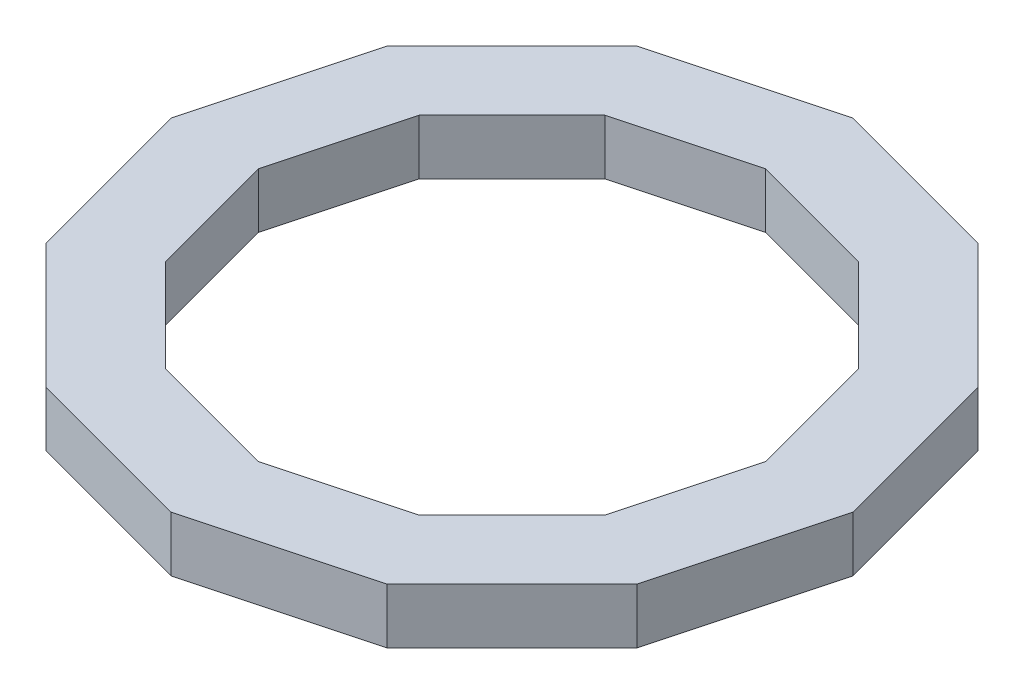
ISO-10303-21;
HEADER;
FILE_DESCRIPTION(('STEP AP214'),'2;1');
FILE_NAME('part.step','',(''),(''),'','','');
FILE_SCHEMA(('AUTOMOTIVE_DESIGN { 1 0 10303 214 1 1 1 1 }'));
ENDSEC;
DATA;
#1=APPLICATION_CONTEXT('core data for automotive mechanical design processes');
#2=APPLICATION_PROTOCOL_DEFINITION('international standard','automotive_design',2000,#1);
#3=PRODUCT_CONTEXT('',#1,'mechanical');
#4=PRODUCT('Part','Part','',(#3));
#5=PRODUCT_RELATED_PRODUCT_CATEGORY('part','',(#4));
#6=PRODUCT_DEFINITION_FORMATION('','',#4);
#7=PRODUCT_DEFINITION_CONTEXT('part definition',#1,'design');
#8=PRODUCT_DEFINITION('design','',#6,#7);
#9=PRODUCT_DEFINITION_SHAPE('','',#8);
#10=(LENGTH_UNIT() NAMED_UNIT(*) SI_UNIT(.MILLI.,.METRE.));
#11=(NAMED_UNIT(*) PLANE_ANGLE_UNIT() SI_UNIT($,.RADIAN.));
#12=(NAMED_UNIT(*) SI_UNIT($,.STERADIAN.) SOLID_ANGLE_UNIT());
#13=UNCERTAINTY_MEASURE_WITH_UNIT(LENGTH_MEASURE(1.E-05),#10,'distance_accuracy_value','');
#14=(GEOMETRIC_REPRESENTATION_CONTEXT(3) GLOBAL_UNCERTAINTY_ASSIGNED_CONTEXT((#13)) GLOBAL_UNIT_ASSIGNED_CONTEXT((#10,
#11,#12)) REPRESENTATION_CONTEXT('',''));
#15=CARTESIAN_POINT('',(0.,0.,0.));
#16=DIRECTION('',(0.,0.,1.));
#17=DIRECTION('',(1.,0.,0.));
#18=AXIS2_PLACEMENT_3D('',#15,#16,#17);
#19=CARTESIAN_POINT('',(0.,19.05,0.));
#20=DIRECTION('',(0.,1.,0.));
#21=DIRECTION('',(0.,0.,1.));
#22=AXIS2_PLACEMENT_3D('',#19,#20,#21);
#23=PLANE('',#22);
#24=DIRECTION('',(0.258819045102521,0.,-0.965925826289068));
#25=VECTOR('',#24,1.);
#26=CARTESIAN_POINT('',(101.988067751713,19.05,58.8828383705816));
#27=LINE('',#26,#25);
#28=CARTESIAN_POINT('',(101.988067751713,19.05,58.8828383705816));
#29=VERTEX_POINT('',#28);
#30=CARTESIAN_POINT('',(117.765676741163,19.05,0.));
#31=VERTEX_POINT('',#30);
#32=EDGE_CURVE('E299',#29,#31,#27,.T.);
#33=ORIENTED_EDGE('',*,*,#32,.T.);
#34=DIRECTION('',(-0.258819045102521,0.,-0.965925826289068));
#35=VECTOR('',#34,1.);
#36=CARTESIAN_POINT('',(117.765676741163,19.05,0.));
#37=LINE('',#36,#35);
#38=CARTESIAN_POINT('',(101.988067751713,19.05,-58.8828383705815));
#39=VERTEX_POINT('',#38);
#40=EDGE_CURVE('E302',#31,#39,#37,.T.);
#41=ORIENTED_EDGE('',*,*,#40,.T.);
#42=DIRECTION('',(-0.707106781186547,0.,-0.707106781186548));
#43=VECTOR('',#42,1.);
#44=CARTESIAN_POINT('',(101.988067751713,19.05,-58.8828383705815));
#45=LINE('',#44,#43);
#46=CARTESIAN_POINT('',(58.8828383705815,19.05,-101.988067751714));
#47=VERTEX_POINT('',#46);
#48=EDGE_CURVE('E306',#39,#47,#45,.T.);
#49=ORIENTED_EDGE('',*,*,#48,.T.);
#50=DIRECTION('',(-0.965925826289068,0.,-0.258819045102521));
#51=VECTOR('',#50,1.);
#52=CARTESIAN_POINT('',(58.8828383705815,19.05,-101.988067751714));
#53=LINE('',#52,#51);
#54=CARTESIAN_POINT('',(0.,19.05,-117.765676741163));
#55=VERTEX_POINT('',#54);
#56=EDGE_CURVE('E308',#47,#55,#53,.T.);
#57=ORIENTED_EDGE('',*,*,#56,.T.);
#58=DIRECTION('',(-0.965925826289069,0.,0.25881904510252));
#59=VECTOR('',#58,1.);
#60=CARTESIAN_POINT('',(0.,19.05,-117.765676741163));
#61=LINE('',#60,#59);
#62=CARTESIAN_POINT('',(-58.8828383705815,19.05,-101.988067751714));
#63=VERTEX_POINT('',#62);
#64=EDGE_CURVE('E310',#55,#63,#61,.T.);
#65=ORIENTED_EDGE('',*,*,#64,.T.);
#66=DIRECTION('',(-0.707106781186547,0.,0.707106781186547));
#67=VECTOR('',#66,1.);
#68=CARTESIAN_POINT('',(-58.8828383705815,19.05,-101.988067751714));
#69=LINE('',#68,#67);
#70=CARTESIAN_POINT('',(-101.988067751713,19.05,-58.8828383705816));
#71=VERTEX_POINT('',#70);
#72=EDGE_CURVE('E312',#63,#71,#69,.T.);
#73=ORIENTED_EDGE('',*,*,#72,.T.);
#74=DIRECTION('',(-0.258819045102521,0.,0.965925826289068));
#75=VECTOR('',#74,1.);
#76=CARTESIAN_POINT('',(-101.988067751713,19.05,-58.8828383705816));
#77=LINE('',#76,#75);
#78=CARTESIAN_POINT('',(-117.765676741163,19.05,0.));
#79=VERTEX_POINT('',#78);
#80=EDGE_CURVE('E314',#71,#79,#77,.T.);
#81=ORIENTED_EDGE('',*,*,#80,.T.);
#82=DIRECTION('',(0.25881904510252,0.,0.965925826289069));
#83=VECTOR('',#82,1.);
#84=CARTESIAN_POINT('',(-117.765676741163,19.05,0.));
#85=LINE('',#84,#83);
#86=CARTESIAN_POINT('',(-101.988067751714,19.05,58.8828383705815));
#87=VERTEX_POINT('',#86);
#88=EDGE_CURVE('E316',#79,#87,#85,.T.);
#89=ORIENTED_EDGE('',*,*,#88,.T.);
#90=DIRECTION('',(0.707106781186547,0.,0.707106781186548));
#91=VECTOR('',#90,1.);
#92=CARTESIAN_POINT('',(-101.988067751714,19.05,58.8828383705815));
#93=LINE('',#92,#91);
#94=CARTESIAN_POINT('',(-58.8828383705816,19.05,101.988067751713));
#95=VERTEX_POINT('',#94);
#96=EDGE_CURVE('E318',#87,#95,#93,.T.);
#97=ORIENTED_EDGE('',*,*,#96,.T.);
#98=DIRECTION('',(0.965925826289068,0.,0.258819045102521));
#99=VECTOR('',#98,1.);
#100=CARTESIAN_POINT('',(-58.8828383705816,19.05,101.988067751713));
#101=LINE('',#100,#99);
#102=CARTESIAN_POINT('',(0.,19.05,117.765676741163));
#103=VERTEX_POINT('',#102);
#104=EDGE_CURVE('E320',#95,#103,#101,.T.);
#105=ORIENTED_EDGE('',*,*,#104,.T.);
#106=DIRECTION('',(0.965925826289068,0.,-0.25881904510252));
#107=VECTOR('',#106,1.);
#108=CARTESIAN_POINT('',(0.,19.05,117.765676741163));
#109=LINE('',#108,#107);
#110=CARTESIAN_POINT('',(58.8828383705815,19.05,101.988067751714));
#111=VERTEX_POINT('',#110);
#112=EDGE_CURVE('E322',#103,#111,#109,.T.);
#113=ORIENTED_EDGE('',*,*,#112,.T.);
#114=DIRECTION('',(0.707106781186548,0.,-0.707106781186547));
#115=VECTOR('',#114,1.);
#116=CARTESIAN_POINT('',(58.8828383705815,19.05,101.988067751714));
#117=LINE('',#116,#115);
#118=EDGE_CURVE('E324',#111,#29,#117,.T.);
#119=ORIENTED_EDGE('',*,*,#118,.T.);
#120=EDGE_LOOP('',(#33,#41,#49,#57,#65,#73,#81,#89,#97,#105,#113,#119));
#121=FACE_BOUND('',#120,.T.);
#122=DIRECTION('',(-0.258819045102521,0.,-0.965925826289068));
#123=VECTOR('',#122,1.);
#124=CARTESIAN_POINT('',(87.5252595113846,19.05,0.));
#125=LINE('',#124,#123);
#126=CARTESIAN_POINT('',(87.5252595113846,19.05,0.));
#127=VERTEX_POINT('',#126);
#128=CARTESIAN_POINT('',(75.7990982096847,19.05,-43.7626297556922));
#129=VERTEX_POINT('',#128);
#130=EDGE_CURVE('E204',#127,#129,#125,.T.);
#131=ORIENTED_EDGE('',*,*,#130,.F.);
#132=DIRECTION('',(0.258819045102521,0.,-0.965925826289068));
#133=VECTOR('',#132,1.);
#134=CARTESIAN_POINT('',(75.7990982096846,19.05,43.7626297556923));
#135=LINE('',#134,#133);
#136=CARTESIAN_POINT('',(75.7990982096846,19.05,43.7626297556923));
#137=VERTEX_POINT('',#136);
#138=EDGE_CURVE('E196',#137,#127,#135,.T.);
#139=ORIENTED_EDGE('',*,*,#138,.F.);
#140=DIRECTION('',(0.707106781186548,0.,-0.707106781186547));
#141=VECTOR('',#140,1.);
#142=CARTESIAN_POINT('',(43.7626297556923,19.05,75.7990982096846));
#143=LINE('',#142,#141);
#144=CARTESIAN_POINT('',(43.7626297556923,19.05,75.7990982096846));
#145=VERTEX_POINT('',#144);
#146=EDGE_CURVE('E243',#145,#137,#143,.T.);
#147=ORIENTED_EDGE('',*,*,#146,.F.);
#148=DIRECTION('',(0.965925826289068,0.,-0.258819045102521));
#149=VECTOR('',#148,1.);
#150=CARTESIAN_POINT('',(0.,19.05,87.5252595113846));
#151=LINE('',#150,#149);
#152=CARTESIAN_POINT('',(0.,19.05,87.5252595113846));
#153=VERTEX_POINT('',#152);
#154=EDGE_CURVE('E241',#153,#145,#151,.T.);
#155=ORIENTED_EDGE('',*,*,#154,.F.);
#156=DIRECTION('',(0.965925826289068,0.,0.258819045102521));
#157=VECTOR('',#156,1.);
#158=CARTESIAN_POINT('',(-43.7626297556923,19.05,75.7990982096846));
#159=LINE('',#158,#157);
#160=CARTESIAN_POINT('',(-43.7626297556923,19.05,75.7990982096846));
#161=VERTEX_POINT('',#160);
#162=EDGE_CURVE('E239',#161,#153,#159,.T.);
#163=ORIENTED_EDGE('',*,*,#162,.F.);
#164=DIRECTION('',(0.707106781186547,0.,0.707106781186547));
#165=VECTOR('',#164,1.);
#166=CARTESIAN_POINT('',(-75.7990982096846,19.05,43.7626297556923));
#167=LINE('',#166,#165);
#168=CARTESIAN_POINT('',(-75.7990982096846,19.05,43.7626297556923));
#169=VERTEX_POINT('',#168);
#170=EDGE_CURVE('E237',#169,#161,#167,.T.);
#171=ORIENTED_EDGE('',*,*,#170,.F.);
#172=DIRECTION('',(0.258819045102521,0.,0.965925826289068));
#173=VECTOR('',#172,1.);
#174=CARTESIAN_POINT('',(-87.5252595113846,19.05,0.));
#175=LINE('',#174,#173);
#176=CARTESIAN_POINT('',(-87.5252595113846,19.05,0.));
#177=VERTEX_POINT('',#176);
#178=EDGE_CURVE('E235',#177,#169,#175,.T.);
#179=ORIENTED_EDGE('',*,*,#178,.F.);
#180=DIRECTION('',(-0.258819045102521,0.,0.965925826289068));
#181=VECTOR('',#180,1.);
#182=CARTESIAN_POINT('',(-75.7990982096846,19.05,-43.7626297556923));
#183=LINE('',#182,#181);
#184=CARTESIAN_POINT('',(-75.7990982096846,19.05,-43.7626297556923));
#185=VERTEX_POINT('',#184);
#186=EDGE_CURVE('E233',#185,#177,#183,.T.);
#187=ORIENTED_EDGE('',*,*,#186,.F.);
#188=DIRECTION('',(-0.707106781186548,0.,0.707106781186548));
#189=VECTOR('',#188,1.);
#190=CARTESIAN_POINT('',(-43.7626297556923,19.05,-75.7990982096846));
#191=LINE('',#190,#189);
#192=CARTESIAN_POINT('',(-43.7626297556923,19.05,-75.7990982096846));
#193=VERTEX_POINT('',#192);
#194=EDGE_CURVE('E231',#193,#185,#191,.T.);
#195=ORIENTED_EDGE('',*,*,#194,.F.);
#196=DIRECTION('',(-0.965925826289068,0.,0.258819045102521));
#197=VECTOR('',#196,1.);
#198=CARTESIAN_POINT('',(0.,19.05,-87.5252595113846));
#199=LINE('',#198,#197);
#200=CARTESIAN_POINT('',(0.,19.05,-87.5252595113846));
#201=VERTEX_POINT('',#200);
#202=EDGE_CURVE('E228',#201,#193,#199,.T.);
#203=ORIENTED_EDGE('',*,*,#202,.F.);
#204=DIRECTION('',(-0.965925826289068,0.,-0.258819045102521));
#205=VECTOR('',#204,1.);
#206=CARTESIAN_POINT('',(43.7626297556922,19.05,-75.7990982096847));
#207=LINE('',#206,#205);
#208=CARTESIAN_POINT('',(43.7626297556922,19.05,-75.7990982096847));
#209=VERTEX_POINT('',#208);
#210=EDGE_CURVE('E223',#209,#201,#207,.T.);
#211=ORIENTED_EDGE('',*,*,#210,.F.);
#212=DIRECTION('',(-0.707106781186548,0.,-0.707106781186547));
#213=VECTOR('',#212,1.);
#214=CARTESIAN_POINT('',(75.7990982096847,19.05,-43.7626297556922));
#215=LINE('',#214,#213);
#216=EDGE_CURVE('E217',#129,#209,#215,.T.);
#217=ORIENTED_EDGE('',*,*,#216,.F.);
#218=EDGE_LOOP('',(#131,#139,#147,#155,#163,#171,#179,#187,#195,#203,#211,#217));
#219=FACE_BOUND('',#218,.T.);
#220=ADVANCED_FACE('F35',(#121,#219),#23,.T.);
#221=CARTESIAN_POINT('',(0.,0.,0.));
#222=DIRECTION('',(0.,1.,0.));
#223=DIRECTION('',(0.,0.,1.));
#224=AXIS2_PLACEMENT_3D('',#221,#222,#223);
#225=PLANE('',#224);
#226=DIRECTION('',(0.258819045102521,0.,-0.965925826289068));
#227=VECTOR('',#226,1.);
#228=CARTESIAN_POINT('',(101.988067751713,0.,58.8828383705816));
#229=LINE('',#228,#227);
#230=CARTESIAN_POINT('',(101.988067751713,0.,58.8828383705816));
#231=VERTEX_POINT('',#230);
#232=CARTESIAN_POINT('',(117.765676741163,0.,0.));
#233=VERTEX_POINT('',#232);
#234=EDGE_CURVE('E212',#231,#233,#229,.T.);
#235=ORIENTED_EDGE('',*,*,#234,.F.);
#236=DIRECTION('',(0.707106781186548,0.,-0.707106781186547));
#237=VECTOR('',#236,1.);
#238=CARTESIAN_POINT('',(58.8828383705815,0.,101.988067751714));
#239=LINE('',#238,#237);
#240=CARTESIAN_POINT('',(58.8828383705815,0.,101.988067751714));
#241=VERTEX_POINT('',#240);
#242=EDGE_CURVE('E303',#241,#231,#239,.T.);
#243=ORIENTED_EDGE('',*,*,#242,.F.);
#244=DIRECTION('',(0.965925826289068,0.,-0.25881904510252));
#245=VECTOR('',#244,1.);
#246=CARTESIAN_POINT('',(0.,0.,117.765676741163));
#247=LINE('',#246,#245);
#248=CARTESIAN_POINT('',(0.,0.,117.765676741163));
#249=VERTEX_POINT('',#248);
#250=EDGE_CURVE('E348',#249,#241,#247,.T.);
#251=ORIENTED_EDGE('',*,*,#250,.F.);
#252=DIRECTION('',(0.965925826289068,0.,0.258819045102521));
#253=VECTOR('',#252,1.);
#254=CARTESIAN_POINT('',(-58.8828383705816,0.,101.988067751713));
#255=LINE('',#254,#253);
#256=CARTESIAN_POINT('',(-58.8828383705816,0.,101.988067751713));
#257=VERTEX_POINT('',#256);
#258=EDGE_CURVE('E346',#257,#249,#255,.T.);
#259=ORIENTED_EDGE('',*,*,#258,.F.);
#260=DIRECTION('',(0.707106781186547,0.,0.707106781186548));
#261=VECTOR('',#260,1.);
#262=CARTESIAN_POINT('',(-101.988067751714,0.,58.8828383705815));
#263=LINE('',#262,#261);
#264=CARTESIAN_POINT('',(-101.988067751714,0.,58.8828383705815));
#265=VERTEX_POINT('',#264);
#266=EDGE_CURVE('E344',#265,#257,#263,.T.);
#267=ORIENTED_EDGE('',*,*,#266,.F.);
#268=DIRECTION('',(0.25881904510252,0.,0.965925826289069));
#269=VECTOR('',#268,1.);
#270=CARTESIAN_POINT('',(-117.765676741163,0.,0.));
#271=LINE('',#270,#269);
#272=CARTESIAN_POINT('',(-117.765676741163,0.,0.));
#273=VERTEX_POINT('',#272);
#274=EDGE_CURVE('E342',#273,#265,#271,.T.);
#275=ORIENTED_EDGE('',*,*,#274,.F.);
#276=DIRECTION('',(-0.258819045102521,0.,0.965925826289068));
#277=VECTOR('',#276,1.);
#278=CARTESIAN_POINT('',(-101.988067751713,0.,-58.8828383705816));
#279=LINE('',#278,#277);
#280=CARTESIAN_POINT('',(-101.988067751713,0.,-58.8828383705816));
#281=VERTEX_POINT('',#280);
#282=EDGE_CURVE('E340',#281,#273,#279,.T.);
#283=ORIENTED_EDGE('',*,*,#282,.F.);
#284=DIRECTION('',(-0.707106781186547,0.,0.707106781186547));
#285=VECTOR('',#284,1.);
#286=CARTESIAN_POINT('',(-58.8828383705815,0.,-101.988067751714));
#287=LINE('',#286,#285);
#288=CARTESIAN_POINT('',(-58.8828383705815,0.,-101.988067751714));
#289=VERTEX_POINT('',#288);
#290=EDGE_CURVE('E338',#289,#281,#287,.T.);
#291=ORIENTED_EDGE('',*,*,#290,.F.);
#292=DIRECTION('',(-0.965925826289069,0.,0.25881904510252));
#293=VECTOR('',#292,1.);
#294=CARTESIAN_POINT('',(0.,0.,-117.765676741163));
#295=LINE('',#294,#293);
#296=CARTESIAN_POINT('',(0.,0.,-117.765676741163));
#297=VERTEX_POINT('',#296);
#298=EDGE_CURVE('E336',#297,#289,#295,.T.);
#299=ORIENTED_EDGE('',*,*,#298,.F.);
#300=DIRECTION('',(-0.965925826289068,0.,-0.258819045102521));
#301=VECTOR('',#300,1.);
#302=CARTESIAN_POINT('',(58.8828383705815,0.,-101.988067751714));
#303=LINE('',#302,#301);
#304=CARTESIAN_POINT('',(58.8828383705815,0.,-101.988067751714));
#305=VERTEX_POINT('',#304);
#306=EDGE_CURVE('E334',#305,#297,#303,.T.);
#307=ORIENTED_EDGE('',*,*,#306,.F.);
#308=DIRECTION('',(-0.707106781186547,0.,-0.707106781186548));
#309=VECTOR('',#308,1.);
#310=CARTESIAN_POINT('',(101.988067751713,0.,-58.8828383705815));
#311=LINE('',#310,#309);
#312=CARTESIAN_POINT('',(101.988067751713,0.,-58.8828383705815));
#313=VERTEX_POINT('',#312);
#314=EDGE_CURVE('E332',#313,#305,#311,.T.);
#315=ORIENTED_EDGE('',*,*,#314,.F.);
#316=DIRECTION('',(-0.258819045102521,0.,-0.965925826289068));
#317=VECTOR('',#316,1.);
#318=CARTESIAN_POINT('',(117.765676741163,0.,0.));
#319=LINE('',#318,#317);
#320=EDGE_CURVE('E329',#233,#313,#319,.T.);
#321=ORIENTED_EDGE('',*,*,#320,.F.);
#322=EDGE_LOOP('',(#235,#243,#251,#259,#267,#275,#283,#291,#299,#307,#315,#321));
#323=FACE_BOUND('',#322,.T.);
#324=DIRECTION('',(0.258819045102521,0.,-0.965925826289068));
#325=VECTOR('',#324,1.);
#326=CARTESIAN_POINT('',(75.7990982096846,0.,43.7626297556923));
#327=LINE('',#326,#325);
#328=CARTESIAN_POINT('',(75.7990982096846,0.,43.7626297556923));
#329=VERTEX_POINT('',#328);
#330=CARTESIAN_POINT('',(87.5252595113846,0.,0.));
#331=VERTEX_POINT('',#330);
#332=EDGE_CURVE('E58',#329,#331,#327,.T.);
#333=ORIENTED_EDGE('',*,*,#332,.T.);
#334=DIRECTION('',(-0.258819045102521,0.,-0.965925826289068));
#335=VECTOR('',#334,1.);
#336=CARTESIAN_POINT('',(87.5252595113846,0.,0.));
#337=LINE('',#336,#335);
#338=CARTESIAN_POINT('',(75.7990982096847,0.,-43.7626297556922));
#339=VERTEX_POINT('',#338);
#340=EDGE_CURVE('E211',#331,#339,#337,.T.);
#341=ORIENTED_EDGE('',*,*,#340,.T.);
#342=DIRECTION('',(-0.707106781186548,0.,-0.707106781186547));
#343=VECTOR('',#342,1.);
#344=CARTESIAN_POINT('',(75.7990982096847,0.,-43.7626297556922));
#345=LINE('',#344,#343);
#346=CARTESIAN_POINT('',(43.7626297556922,0.,-75.7990982096847));
#347=VERTEX_POINT('',#346);
#348=EDGE_CURVE('E248',#339,#347,#345,.T.);
#349=ORIENTED_EDGE('',*,*,#348,.T.);
#350=DIRECTION('',(-0.965925826289068,0.,-0.258819045102521));
#351=VECTOR('',#350,1.);
#352=CARTESIAN_POINT('',(43.7626297556922,0.,-75.7990982096847));
#353=LINE('',#352,#351);
#354=CARTESIAN_POINT('',(0.,0.,-87.5252595113846));
#355=VERTEX_POINT('',#354);
#356=EDGE_CURVE('E251',#347,#355,#353,.T.);
#357=ORIENTED_EDGE('',*,*,#356,.T.);
#358=DIRECTION('',(-0.965925826289068,0.,0.258819045102521));
#359=VECTOR('',#358,1.);
#360=CARTESIAN_POINT('',(0.,0.,-87.5252595113846));
#361=LINE('',#360,#359);
#362=CARTESIAN_POINT('',(-43.7626297556923,0.,-75.7990982096846));
#363=VERTEX_POINT('',#362);
#364=EDGE_CURVE('E255',#355,#363,#361,.T.);
#365=ORIENTED_EDGE('',*,*,#364,.T.);
#366=DIRECTION('',(-0.707106781186548,0.,0.707106781186548));
#367=VECTOR('',#366,1.);
#368=CARTESIAN_POINT('',(-43.7626297556923,0.,-75.7990982096846));
#369=LINE('',#368,#367);
#370=CARTESIAN_POINT('',(-75.7990982096846,0.,-43.7626297556923));
#371=VERTEX_POINT('',#370);
#372=EDGE_CURVE('E258',#363,#371,#369,.T.);
#373=ORIENTED_EDGE('',*,*,#372,.T.);
#374=DIRECTION('',(-0.258819045102521,0.,0.965925826289068));
#375=VECTOR('',#374,1.);
#376=CARTESIAN_POINT('',(-75.7990982096846,0.,-43.7626297556923));
#377=LINE('',#376,#375);
#378=CARTESIAN_POINT('',(-87.5252595113846,0.,0.));
#379=VERTEX_POINT('',#378);
#380=EDGE_CURVE('E261',#371,#379,#377,.T.);
#381=ORIENTED_EDGE('',*,*,#380,.T.);
#382=DIRECTION('',(0.258819045102521,0.,0.965925826289068));
#383=VECTOR('',#382,1.);
#384=CARTESIAN_POINT('',(-87.5252595113846,0.,0.));
#385=LINE('',#384,#383);
#386=CARTESIAN_POINT('',(-75.7990982096846,0.,43.7626297556923));
#387=VERTEX_POINT('',#386);
#388=EDGE_CURVE('E265',#379,#387,#385,.T.);
#389=ORIENTED_EDGE('',*,*,#388,.T.);
#390=DIRECTION('',(0.707106781186547,0.,0.707106781186547));
#391=VECTOR('',#390,1.);
#392=CARTESIAN_POINT('',(-75.7990982096846,0.,43.7626297556923));
#393=LINE('',#392,#391);
#394=CARTESIAN_POINT('',(-43.7626297556923,0.,75.7990982096846));
#395=VERTEX_POINT('',#394);
#396=EDGE_CURVE('E268',#387,#395,#393,.T.);
#397=ORIENTED_EDGE('',*,*,#396,.T.);
#398=DIRECTION('',(0.965925826289068,0.,0.258819045102521));
#399=VECTOR('',#398,1.);
#400=CARTESIAN_POINT('',(-43.7626297556923,0.,75.7990982096846));
#401=LINE('',#400,#399);
#402=CARTESIAN_POINT('',(0.,0.,87.5252595113846));
#403=VERTEX_POINT('',#402);
#404=EDGE_CURVE('E271',#395,#403,#401,.T.);
#405=ORIENTED_EDGE('',*,*,#404,.T.);
#406=DIRECTION('',(0.965925826289068,0.,-0.258819045102521));
#407=VECTOR('',#406,1.);
#408=CARTESIAN_POINT('',(0.,0.,87.5252595113846));
#409=LINE('',#408,#407);
#410=CARTESIAN_POINT('',(43.7626297556923,0.,75.7990982096846));
#411=VERTEX_POINT('',#410);
#412=EDGE_CURVE('E274',#403,#411,#409,.T.);
#413=ORIENTED_EDGE('',*,*,#412,.T.);
#414=DIRECTION('',(0.707106781186548,0.,-0.707106781186547));
#415=VECTOR('',#414,1.);
#416=CARTESIAN_POINT('',(43.7626297556923,0.,75.7990982096846));
#417=LINE('',#416,#415);
#418=EDGE_CURVE('E205',#411,#329,#417,.T.);
#419=ORIENTED_EDGE('',*,*,#418,.T.);
#420=EDGE_LOOP('',(#333,#341,#349,#357,#365,#373,#381,#389,#397,#405,#413,#419));
#421=FACE_BOUND('',#420,.T.);
#422=ADVANCED_FACE('F391',(#323,#421),#225,.F.);
#423=CARTESIAN_POINT('',(101.988067751713,19.05,58.8828383705816));
#424=DIRECTION('',(-0.965925826289068,0.,-0.258819045102521));
#425=DIRECTION('',(-0.258819045102521,0.,0.965925826289068));
#426=AXIS2_PLACEMENT_3D('',#423,#424,#425);
#427=PLANE('',#426);
#428=ORIENTED_EDGE('',*,*,#234,.T.);
#429=DIRECTION('',(0.,-1.,0.));
#430=VECTOR('',#429,1.);
#431=CARTESIAN_POINT('',(117.765676741163,19.05,0.));
#432=LINE('',#431,#430);
#433=EDGE_CURVE('E11',#31,#233,#432,.T.);
#434=ORIENTED_EDGE('',*,*,#433,.F.);
#435=ORIENTED_EDGE('',*,*,#32,.F.);
#436=DIRECTION('',(0.,-1.,0.));
#437=VECTOR('',#436,1.);
#438=CARTESIAN_POINT('',(101.988067751713,19.05,58.8828383705816));
#439=LINE('',#438,#437);
#440=EDGE_CURVE('E326',#29,#231,#439,.T.);
#441=ORIENTED_EDGE('',*,*,#440,.T.);
#442=EDGE_LOOP('',(#428,#434,#435,#441));
#443=FACE_BOUND('',#442,.T.);
#444=ADVANCED_FACE('F37',(#443),#427,.F.);
#445=CARTESIAN_POINT('',(117.765676741163,19.05,0.));
#446=DIRECTION('',(-0.965925826289068,0.,0.258819045102521));
#447=DIRECTION('',(0.258819045102521,0.,0.965925826289068));
#448=AXIS2_PLACEMENT_3D('',#445,#446,#447);
#449=PLANE('',#448);
#450=ORIENTED_EDGE('',*,*,#320,.T.);
#451=DIRECTION('',(0.,-1.,0.));
#452=VECTOR('',#451,1.);
#453=CARTESIAN_POINT('',(101.988067751713,19.05,-58.8828383705815));
#454=LINE('',#453,#452);
#455=EDGE_CURVE('E43',#39,#313,#454,.T.);
#456=ORIENTED_EDGE('',*,*,#455,.F.);
#457=ORIENTED_EDGE('',*,*,#40,.F.);
#458=ORIENTED_EDGE('',*,*,#433,.T.);
#459=EDGE_LOOP('',(#450,#456,#457,#458));
#460=FACE_BOUND('',#459,.T.);
#461=ADVANCED_FACE('F408',(#460),#449,.F.);
#462=CARTESIAN_POINT('',(101.988067751713,19.05,-58.8828383705815));
#463=DIRECTION('',(-0.707106781186548,0.,0.707106781186547));
#464=DIRECTION('',(0.707106781186547,0.,0.707106781186548));
#465=AXIS2_PLACEMENT_3D('',#462,#463,#464);
#466=PLANE('',#465);
#467=ORIENTED_EDGE('',*,*,#314,.T.);
#468=DIRECTION('',(0.,-1.,0.));
#469=VECTOR('',#468,1.);
#470=CARTESIAN_POINT('',(58.8828383705815,19.05,-101.988067751714));
#471=LINE('',#470,#469);
#472=EDGE_CURVE('E378',#47,#305,#471,.T.);
#473=ORIENTED_EDGE('',*,*,#472,.F.);
#474=ORIENTED_EDGE('',*,*,#48,.F.);
#475=ORIENTED_EDGE('',*,*,#455,.T.);
#476=EDGE_LOOP('',(#467,#473,#474,#475));
#477=FACE_BOUND('',#476,.T.);
#478=ADVANCED_FACE('F385',(#477),#466,.F.);
#479=CARTESIAN_POINT('',(58.8828383705815,19.05,-101.988067751714));
#480=DIRECTION('',(-0.258819045102521,0.,0.965925826289068));
#481=DIRECTION('',(0.965925826289068,0.,0.258819045102521));
#482=AXIS2_PLACEMENT_3D('',#479,#480,#481);
#483=PLANE('',#482);
#484=ORIENTED_EDGE('',*,*,#306,.T.);
#485=DIRECTION('',(0.,-1.,0.));
#486=VECTOR('',#485,1.);
#487=CARTESIAN_POINT('',(0.,19.05,-117.765676741163));
#488=LINE('',#487,#486);
#489=EDGE_CURVE('E375',#55,#297,#488,.T.);
#490=ORIENTED_EDGE('',*,*,#489,.F.);
#491=ORIENTED_EDGE('',*,*,#56,.F.);
#492=ORIENTED_EDGE('',*,*,#472,.T.);
#493=EDGE_LOOP('',(#484,#490,#491,#492));
#494=FACE_BOUND('',#493,.T.);
#495=ADVANCED_FACE('F397',(#494),#483,.F.);
#496=CARTESIAN_POINT('',(0.,19.05,-117.765676741163));
#497=DIRECTION('',(0.25881904510252,0.,0.965925826289068));
#498=DIRECTION('',(0.965925826289069,0.,-0.25881904510252));
#499=AXIS2_PLACEMENT_3D('',#496,#497,#498);
#500=PLANE('',#499);
#501=ORIENTED_EDGE('',*,*,#298,.T.);
#502=DIRECTION('',(0.,-1.,0.));
#503=VECTOR('',#502,1.);
#504=CARTESIAN_POINT('',(-58.8828383705815,19.05,-101.988067751714));
#505=LINE('',#504,#503);
#506=EDGE_CURVE('E372',#63,#289,#505,.T.);
#507=ORIENTED_EDGE('',*,*,#506,.F.);
#508=ORIENTED_EDGE('',*,*,#64,.F.);
#509=ORIENTED_EDGE('',*,*,#489,.T.);
#510=EDGE_LOOP('',(#501,#507,#508,#509));
#511=FACE_BOUND('',#510,.T.);
#512=ADVANCED_FACE('F401',(#511),#500,.F.);
#513=CARTESIAN_POINT('',(-58.8828383705815,19.05,-101.988067751714));
#514=DIRECTION('',(0.707106781186547,0.,0.707106781186547));
#515=DIRECTION('',(0.707106781186548,0.,-0.707106781186548));
#516=AXIS2_PLACEMENT_3D('',#513,#514,#515);
#517=PLANE('',#516);
#518=ORIENTED_EDGE('',*,*,#290,.T.);
#519=DIRECTION('',(0.,-1.,0.));
#520=VECTOR('',#519,1.);
#521=CARTESIAN_POINT('',(-101.988067751713,19.05,-58.8828383705816));
#522=LINE('',#521,#520);
#523=EDGE_CURVE('E368',#71,#281,#522,.T.);
#524=ORIENTED_EDGE('',*,*,#523,.F.);
#525=ORIENTED_EDGE('',*,*,#72,.F.);
#526=ORIENTED_EDGE('',*,*,#506,.T.);
#527=EDGE_LOOP('',(#518,#524,#525,#526));
#528=FACE_BOUND('',#527,.T.);
#529=ADVANCED_FACE('F441',(#528),#517,.F.);
#530=CARTESIAN_POINT('',(-101.988067751713,19.05,-58.8828383705816));
#531=DIRECTION('',(0.965925826289068,0.,0.258819045102521));
#532=DIRECTION('',(0.258819045102521,0.,-0.965925826289068));
#533=AXIS2_PLACEMENT_3D('',#530,#531,#532);
#534=PLANE('',#533);
#535=ORIENTED_EDGE('',*,*,#282,.T.);
#536=DIRECTION('',(0.,-1.,0.));
#537=VECTOR('',#536,1.);
#538=CARTESIAN_POINT('',(-117.765676741163,19.05,0.));
#539=LINE('',#538,#537);
#540=EDGE_CURVE('E365',#79,#273,#539,.T.);
#541=ORIENTED_EDGE('',*,*,#540,.F.);
#542=ORIENTED_EDGE('',*,*,#80,.F.);
#543=ORIENTED_EDGE('',*,*,#523,.T.);
#544=EDGE_LOOP('',(#535,#541,#542,#543));
#545=FACE_BOUND('',#544,.T.);
#546=ADVANCED_FACE('F439',(#545),#534,.F.);
#547=CARTESIAN_POINT('',(-117.765676741163,19.05,0.));
#548=DIRECTION('',(0.965925826289068,0.,-0.25881904510252));
#549=DIRECTION('',(-0.25881904510252,0.,-0.965925826289068));
#550=AXIS2_PLACEMENT_3D('',#547,#548,#549);
#551=PLANE('',#550);
#552=ORIENTED_EDGE('',*,*,#274,.T.);
#553=DIRECTION('',(0.,-1.,0.));
#554=VECTOR('',#553,1.);
#555=CARTESIAN_POINT('',(-101.988067751714,19.05,58.8828383705815));
#556=LINE('',#555,#554);
#557=EDGE_CURVE('E362',#87,#265,#556,.T.);
#558=ORIENTED_EDGE('',*,*,#557,.F.);
#559=ORIENTED_EDGE('',*,*,#88,.F.);
#560=ORIENTED_EDGE('',*,*,#540,.T.);
#561=EDGE_LOOP('',(#552,#558,#559,#560));
#562=FACE_BOUND('',#561,.T.);
#563=ADVANCED_FACE('F435',(#562),#551,.F.);
#564=CARTESIAN_POINT('',(-101.988067751714,19.05,58.8828383705815));
#565=DIRECTION('',(0.707106781186548,0.,-0.707106781186547));
#566=DIRECTION('',(-0.707106781186547,0.,-0.707106781186548));
#567=AXIS2_PLACEMENT_3D('',#564,#565,#566);
#568=PLANE('',#567);
#569=ORIENTED_EDGE('',*,*,#266,.T.);
#570=DIRECTION('',(0.,-1.,0.));
#571=VECTOR('',#570,1.);
#572=CARTESIAN_POINT('',(-58.8828383705816,19.05,101.988067751713));
#573=LINE('',#572,#571);
#574=EDGE_CURVE('E359',#95,#257,#573,.T.);
#575=ORIENTED_EDGE('',*,*,#574,.F.);
#576=ORIENTED_EDGE('',*,*,#96,.F.);
#577=ORIENTED_EDGE('',*,*,#557,.T.);
#578=EDGE_LOOP('',(#569,#575,#576,#577));
#579=FACE_BOUND('',#578,.T.);
#580=ADVANCED_FACE('F430',(#579),#568,.F.);
#581=CARTESIAN_POINT('',(-58.8828383705816,19.05,101.988067751713));
#582=DIRECTION('',(0.258819045102521,0.,-0.965925826289068));
#583=DIRECTION('',(-0.965925826289068,0.,-0.258819045102521));
#584=AXIS2_PLACEMENT_3D('',#581,#582,#583);
#585=PLANE('',#584);
#586=ORIENTED_EDGE('',*,*,#258,.T.);
#587=DIRECTION('',(0.,-1.,0.));
#588=VECTOR('',#587,1.);
#589=CARTESIAN_POINT('',(0.,19.05,117.765676741163));
#590=LINE('',#589,#588);
#591=EDGE_CURVE('E356',#103,#249,#590,.T.);
#592=ORIENTED_EDGE('',*,*,#591,.F.);
#593=ORIENTED_EDGE('',*,*,#104,.F.);
#594=ORIENTED_EDGE('',*,*,#574,.T.);
#595=EDGE_LOOP('',(#586,#592,#593,#594));
#596=FACE_BOUND('',#595,.T.);
#597=ADVANCED_FACE('F424',(#596),#585,.F.);
#598=CARTESIAN_POINT('',(0.,19.05,117.765676741163));
#599=DIRECTION('',(-0.25881904510252,0.,-0.965925826289068));
#600=DIRECTION('',(-0.965925826289069,0.,0.25881904510252));
#601=AXIS2_PLACEMENT_3D('',#598,#599,#600);
#602=PLANE('',#601);
#603=ORIENTED_EDGE('',*,*,#250,.T.);
#604=DIRECTION('',(0.,-1.,0.));
#605=VECTOR('',#604,1.);
#606=CARTESIAN_POINT('',(58.8828383705815,19.05,101.988067751714));
#607=LINE('',#606,#605);
#608=EDGE_CURVE('E353',#111,#241,#607,.T.);
#609=ORIENTED_EDGE('',*,*,#608,.F.);
#610=ORIENTED_EDGE('',*,*,#112,.F.);
#611=ORIENTED_EDGE('',*,*,#591,.T.);
#612=EDGE_LOOP('',(#603,#609,#610,#611));
#613=FACE_BOUND('',#612,.T.);
#614=ADVANCED_FACE('F420',(#613),#602,.F.);
#615=CARTESIAN_POINT('',(58.8828383705815,19.05,101.988067751714));
#616=DIRECTION('',(-0.707106781186547,0.,-0.707106781186548));
#617=DIRECTION('',(-0.707106781186548,0.,0.707106781186547));
#618=AXIS2_PLACEMENT_3D('',#615,#616,#617);
#619=PLANE('',#618);
#620=ORIENTED_EDGE('',*,*,#242,.T.);
#621=ORIENTED_EDGE('',*,*,#440,.F.);
#622=ORIENTED_EDGE('',*,*,#118,.F.);
#623=ORIENTED_EDGE('',*,*,#608,.T.);
#624=EDGE_LOOP('',(#620,#621,#622,#623));
#625=FACE_BOUND('',#624,.T.);
#626=ADVANCED_FACE('F415',(#625),#619,.F.);
#627=CARTESIAN_POINT('',(75.7990982096846,19.05,43.7626297556923));
#628=DIRECTION('',(-0.965925826289068,0.,-0.258819045102521));
#629=DIRECTION('',(-0.258819045102521,0.,0.965925826289068));
#630=AXIS2_PLACEMENT_3D('',#627,#628,#629);
#631=PLANE('',#630);
#632=ORIENTED_EDGE('',*,*,#332,.F.);
#633=DIRECTION('',(0.,-1.,0.));
#634=VECTOR('',#633,1.);
#635=CARTESIAN_POINT('',(75.7990982096846,19.05,43.7626297556923));
#636=LINE('',#635,#634);
#637=EDGE_CURVE('E200',#137,#329,#636,.T.);
#638=ORIENTED_EDGE('',*,*,#637,.F.);
#639=ORIENTED_EDGE('',*,*,#138,.T.);
#640=DIRECTION('',(0.,-1.,0.));
#641=VECTOR('',#640,1.);
#642=CARTESIAN_POINT('',(87.5252595113846,19.05,0.));
#643=LINE('',#642,#641);
#644=EDGE_CURVE('E199',#127,#331,#643,.T.);
#645=ORIENTED_EDGE('',*,*,#644,.T.);
#646=EDGE_LOOP('',(#632,#638,#639,#645));
#647=FACE_BOUND('',#646,.T.);
#648=ADVANCED_FACE('F198',(#647),#631,.T.);
#649=CARTESIAN_POINT('',(87.5252595113846,19.05,0.));
#650=DIRECTION('',(-0.965925826289068,0.,0.258819045102521));
#651=DIRECTION('',(0.258819045102521,0.,0.965925826289068));
#652=AXIS2_PLACEMENT_3D('',#649,#650,#651);
#653=PLANE('',#652);
#654=ORIENTED_EDGE('',*,*,#340,.F.);
#655=ORIENTED_EDGE('',*,*,#644,.F.);
#656=ORIENTED_EDGE('',*,*,#130,.T.);
#657=DIRECTION('',(0.,-1.,0.));
#658=VECTOR('',#657,1.);
#659=CARTESIAN_POINT('',(75.7990982096847,19.05,-43.7626297556922));
#660=LINE('',#659,#658);
#661=EDGE_CURVE('E213',#129,#339,#660,.T.);
#662=ORIENTED_EDGE('',*,*,#661,.T.);
#663=EDGE_LOOP('',(#654,#655,#656,#662));
#664=FACE_BOUND('',#663,.T.);
#665=ADVANCED_FACE('F208',(#664),#653,.T.);
#666=CARTESIAN_POINT('',(75.7990982096847,19.05,-43.7626297556922));
#667=DIRECTION('',(-0.707106781186547,0.,0.707106781186548));
#668=DIRECTION('',(0.707106781186548,0.,0.707106781186547));
#669=AXIS2_PLACEMENT_3D('',#666,#667,#668);
#670=PLANE('',#669);
#671=ORIENTED_EDGE('',*,*,#348,.F.);
#672=ORIENTED_EDGE('',*,*,#661,.F.);
#673=ORIENTED_EDGE('',*,*,#216,.T.);
#674=DIRECTION('',(0.,-1.,0.));
#675=VECTOR('',#674,1.);
#676=CARTESIAN_POINT('',(43.7626297556922,19.05,-75.7990982096847));
#677=LINE('',#676,#675);
#678=EDGE_CURVE('E296',#209,#347,#677,.T.);
#679=ORIENTED_EDGE('',*,*,#678,.T.);
#680=EDGE_LOOP('',(#671,#672,#673,#679));
#681=FACE_BOUND('',#680,.T.);
#682=ADVANCED_FACE('F499',(#681),#670,.T.);
#683=CARTESIAN_POINT('',(43.7626297556922,19.05,-75.7990982096847));
#684=DIRECTION('',(-0.258819045102521,0.,0.965925826289068));
#685=DIRECTION('',(0.965925826289068,0.,0.258819045102521));
#686=AXIS2_PLACEMENT_3D('',#683,#684,#685);
#687=PLANE('',#686);
#688=ORIENTED_EDGE('',*,*,#356,.F.);
#689=ORIENTED_EDGE('',*,*,#678,.F.);
#690=ORIENTED_EDGE('',*,*,#210,.T.);
#691=DIRECTION('',(0.,-1.,0.));
#692=VECTOR('',#691,1.);
#693=CARTESIAN_POINT('',(0.,19.05,-87.5252595113846));
#694=LINE('',#693,#692);
#695=EDGE_CURVE('E294',#201,#355,#694,.T.);
#696=ORIENTED_EDGE('',*,*,#695,.T.);
#697=EDGE_LOOP('',(#688,#689,#690,#696));
#698=FACE_BOUND('',#697,.T.);
#699=ADVANCED_FACE('F505',(#698),#687,.T.);
#700=CARTESIAN_POINT('',(0.,19.05,-87.5252595113846));
#701=DIRECTION('',(0.258819045102521,0.,0.965925826289068));
#702=DIRECTION('',(0.965925826289068,0.,-0.258819045102521));
#703=AXIS2_PLACEMENT_3D('',#700,#701,#702);
#704=PLANE('',#703);
#705=ORIENTED_EDGE('',*,*,#364,.F.);
#706=ORIENTED_EDGE('',*,*,#695,.F.);
#707=ORIENTED_EDGE('',*,*,#202,.T.);
#708=DIRECTION('',(0.,-1.,0.));
#709=VECTOR('',#708,1.);
#710=CARTESIAN_POINT('',(-43.7626297556923,19.05,-75.7990982096846));
#711=LINE('',#710,#709);
#712=EDGE_CURVE('E292',#193,#363,#711,.T.);
#713=ORIENTED_EDGE('',*,*,#712,.T.);
#714=EDGE_LOOP('',(#705,#706,#707,#713));
#715=FACE_BOUND('',#714,.T.);
#716=ADVANCED_FACE('F513',(#715),#704,.T.);
#717=CARTESIAN_POINT('',(-43.7626297556923,19.05,-75.7990982096846));
#718=DIRECTION('',(0.707106781186548,0.,0.707106781186548));
#719=DIRECTION('',(0.707106781186548,0.,-0.707106781186548));
#720=AXIS2_PLACEMENT_3D('',#717,#718,#719);
#721=PLANE('',#720);
#722=ORIENTED_EDGE('',*,*,#372,.F.);
#723=ORIENTED_EDGE('',*,*,#712,.F.);
#724=ORIENTED_EDGE('',*,*,#194,.T.);
#725=DIRECTION('',(0.,-1.,0.));
#726=VECTOR('',#725,1.);
#727=CARTESIAN_POINT('',(-75.7990982096846,19.05,-43.7626297556923));
#728=LINE('',#727,#726);
#729=EDGE_CURVE('E290',#185,#371,#728,.T.);
#730=ORIENTED_EDGE('',*,*,#729,.T.);
#731=EDGE_LOOP('',(#722,#723,#724,#730));
#732=FACE_BOUND('',#731,.T.);
#733=ADVANCED_FACE('F521',(#732),#721,.T.);
#734=CARTESIAN_POINT('',(-75.7990982096846,19.05,-43.7626297556923));
#735=DIRECTION('',(0.965925826289068,0.,0.258819045102521));
#736=DIRECTION('',(0.258819045102521,0.,-0.965925826289068));
#737=AXIS2_PLACEMENT_3D('',#734,#735,#736);
#738=PLANE('',#737);
#739=ORIENTED_EDGE('',*,*,#380,.F.);
#740=ORIENTED_EDGE('',*,*,#729,.F.);
#741=ORIENTED_EDGE('',*,*,#186,.T.);
#742=DIRECTION('',(0.,-1.,0.));
#743=VECTOR('',#742,1.);
#744=CARTESIAN_POINT('',(-87.5252595113846,19.05,0.));
#745=LINE('',#744,#743);
#746=EDGE_CURVE('E288',#177,#379,#745,.T.);
#747=ORIENTED_EDGE('',*,*,#746,.T.);
#748=EDGE_LOOP('',(#739,#740,#741,#747));
#749=FACE_BOUND('',#748,.T.);
#750=ADVANCED_FACE('F528',(#749),#738,.T.);
#751=CARTESIAN_POINT('',(-87.5252595113846,19.05,0.));
#752=DIRECTION('',(0.965925826289068,0.,-0.258819045102521));
#753=DIRECTION('',(-0.258819045102521,0.,-0.965925826289068));
#754=AXIS2_PLACEMENT_3D('',#751,#752,#753);
#755=PLANE('',#754);
#756=ORIENTED_EDGE('',*,*,#388,.F.);
#757=ORIENTED_EDGE('',*,*,#746,.F.);
#758=ORIENTED_EDGE('',*,*,#178,.T.);
#759=DIRECTION('',(0.,-1.,0.));
#760=VECTOR('',#759,1.);
#761=CARTESIAN_POINT('',(-75.7990982096846,19.05,43.7626297556923));
#762=LINE('',#761,#760);
#763=EDGE_CURVE('E286',#169,#387,#762,.T.);
#764=ORIENTED_EDGE('',*,*,#763,.T.);
#765=EDGE_LOOP('',(#756,#757,#758,#764));
#766=FACE_BOUND('',#765,.T.);
#767=ADVANCED_FACE('F536',(#766),#755,.T.);
#768=CARTESIAN_POINT('',(-75.7990982096846,19.05,43.7626297556923));
#769=DIRECTION('',(0.707106781186547,0.,-0.707106781186547));
#770=DIRECTION('',(-0.707106781186548,0.,-0.707106781186548));
#771=AXIS2_PLACEMENT_3D('',#768,#769,#770);
#772=PLANE('',#771);
#773=ORIENTED_EDGE('',*,*,#396,.F.);
#774=ORIENTED_EDGE('',*,*,#763,.F.);
#775=ORIENTED_EDGE('',*,*,#170,.T.);
#776=DIRECTION('',(0.,-1.,0.));
#777=VECTOR('',#776,1.);
#778=CARTESIAN_POINT('',(-43.7626297556923,19.05,75.7990982096846));
#779=LINE('',#778,#777);
#780=EDGE_CURVE('E284',#161,#395,#779,.T.);
#781=ORIENTED_EDGE('',*,*,#780,.T.);
#782=EDGE_LOOP('',(#773,#774,#775,#781));
#783=FACE_BOUND('',#782,.T.);
#784=ADVANCED_FACE('F545',(#783),#772,.T.);
#785=CARTESIAN_POINT('',(-43.7626297556923,19.05,75.7990982096846));
#786=DIRECTION('',(0.258819045102521,0.,-0.965925826289068));
#787=DIRECTION('',(-0.965925826289068,0.,-0.258819045102521));
#788=AXIS2_PLACEMENT_3D('',#785,#786,#787);
#789=PLANE('',#788);
#790=ORIENTED_EDGE('',*,*,#404,.F.);
#791=ORIENTED_EDGE('',*,*,#780,.F.);
#792=ORIENTED_EDGE('',*,*,#162,.T.);
#793=DIRECTION('',(0.,-1.,0.));
#794=VECTOR('',#793,1.);
#795=CARTESIAN_POINT('',(0.,19.05,87.5252595113846));
#796=LINE('',#795,#794);
#797=EDGE_CURVE('E282',#153,#403,#796,.T.);
#798=ORIENTED_EDGE('',*,*,#797,.T.);
#799=EDGE_LOOP('',(#790,#791,#792,#798));
#800=FACE_BOUND('',#799,.T.);
#801=ADVANCED_FACE('F552',(#800),#789,.T.);
#802=CARTESIAN_POINT('',(0.,19.05,87.5252595113846));
#803=DIRECTION('',(-0.258819045102521,0.,-0.965925826289068));
#804=DIRECTION('',(-0.965925826289068,0.,0.258819045102521));
#805=AXIS2_PLACEMENT_3D('',#802,#803,#804);
#806=PLANE('',#805);
#807=ORIENTED_EDGE('',*,*,#412,.F.);
#808=ORIENTED_EDGE('',*,*,#797,.F.);
#809=ORIENTED_EDGE('',*,*,#154,.T.);
#810=DIRECTION('',(0.,-1.,0.));
#811=VECTOR('',#810,1.);
#812=CARTESIAN_POINT('',(43.7626297556923,19.05,75.7990982096846));
#813=LINE('',#812,#811);
#814=EDGE_CURVE('E50',#145,#411,#813,.T.);
#815=ORIENTED_EDGE('',*,*,#814,.T.);
#816=EDGE_LOOP('',(#807,#808,#809,#815));
#817=FACE_BOUND('',#816,.T.);
#818=ADVANCED_FACE('F560',(#817),#806,.T.);
#819=CARTESIAN_POINT('',(43.7626297556923,19.05,75.7990982096846));
#820=DIRECTION('',(-0.707106781186547,0.,-0.707106781186548));
#821=DIRECTION('',(-0.707106781186548,0.,0.707106781186547));
#822=AXIS2_PLACEMENT_3D('',#819,#820,#821);
#823=PLANE('',#822);
#824=ORIENTED_EDGE('',*,*,#418,.F.);
#825=ORIENTED_EDGE('',*,*,#814,.F.);
#826=ORIENTED_EDGE('',*,*,#146,.T.);
#827=ORIENTED_EDGE('',*,*,#637,.T.);
#828=EDGE_LOOP('',(#824,#825,#826,#827));
#829=FACE_BOUND('',#828,.T.);
#830=ADVANCED_FACE('F568',(#829),#823,.T.);
#831=CLOSED_SHELL('',(#220,#422,#444,#461,#478,#495,#512,#529,#546,#563,#580,#597,#614,#626,
#648,#665,#682,#699,#716,#733,#750,#767,#784,#801,#818,#830));
#832=MANIFOLD_SOLID_BREP('B2',#831);
#833=ADVANCED_BREP_SHAPE_REPRESENTATION('',(#18,#832),#14);
#834=SHAPE_DEFINITION_REPRESENTATION(#9,#833);
ENDSEC;
END-ISO-10303-21;
